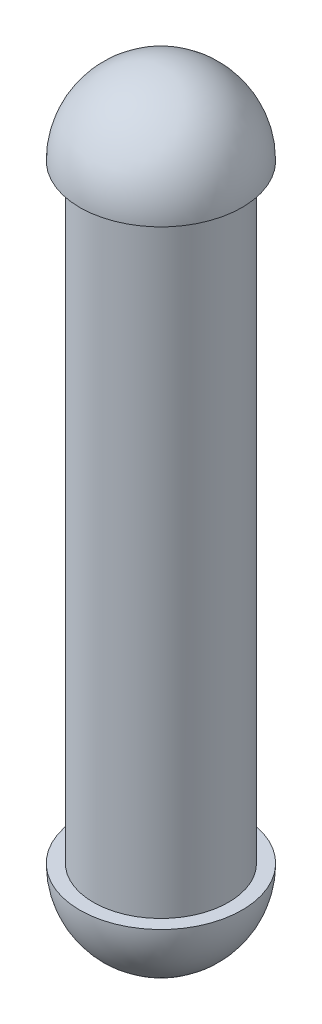
ISO-10303-21;
HEADER;
FILE_DESCRIPTION(('STEP AP214'),'2;1');
FILE_NAME('part.step','',(''),(''),'','','');
FILE_SCHEMA(('AUTOMOTIVE_DESIGN { 1 0 10303 214 1 1 1 1 }'));
ENDSEC;
DATA;
#1=APPLICATION_CONTEXT('core data for automotive mechanical design processes');
#2=APPLICATION_PROTOCOL_DEFINITION('international standard','automotive_design',2000,#1);
#3=PRODUCT_CONTEXT('',#1,'mechanical');
#4=PRODUCT('Part','Part','',(#3));
#5=PRODUCT_RELATED_PRODUCT_CATEGORY('part','',(#4));
#6=PRODUCT_DEFINITION_FORMATION('','',#4);
#7=PRODUCT_DEFINITION_CONTEXT('part definition',#1,'design');
#8=PRODUCT_DEFINITION('design','',#6,#7);
#9=PRODUCT_DEFINITION_SHAPE('','',#8);
#10=(LENGTH_UNIT() NAMED_UNIT(*) SI_UNIT(.MILLI.,.METRE.));
#11=(NAMED_UNIT(*) PLANE_ANGLE_UNIT() SI_UNIT($,.RADIAN.));
#12=(NAMED_UNIT(*) SI_UNIT($,.STERADIAN.) SOLID_ANGLE_UNIT());
#13=UNCERTAINTY_MEASURE_WITH_UNIT(LENGTH_MEASURE(1.E-05),#10,'distance_accuracy_value','');
#14=(GEOMETRIC_REPRESENTATION_CONTEXT(3) GLOBAL_UNCERTAINTY_ASSIGNED_CONTEXT((#13)) GLOBAL_UNIT_ASSIGNED_CONTEXT((#10,
#11,#12)) REPRESENTATION_CONTEXT('',''));
#15=CARTESIAN_POINT('',(0.,0.,0.));
#16=DIRECTION('',(0.,0.,1.));
#17=DIRECTION('',(1.,0.,0.));
#18=AXIS2_PLACEMENT_3D('',#15,#16,#17);
#19=CARTESIAN_POINT('',(0.,4.5,0.));
#20=DIRECTION('',(0.,-1.,0.));
#21=DIRECTION('',(0.,0.,-1.));
#22=AXIS2_PLACEMENT_3D('',#19,#20,#21);
#23=CYLINDRICAL_SURFACE('',#22,1.);
#24=CARTESIAN_POINT('',(0.,4.5,0.));
#25=DIRECTION('',(0.,1.,0.));
#26=DIRECTION('',(0.,0.,1.));
#27=AXIS2_PLACEMENT_3D('',#24,#25,#26);
#28=CIRCLE('',#27,1.);
#29=CARTESIAN_POINT('',(0.,4.5,1.));
#30=VERTEX_POINT('',#29);
#31=EDGE_CURVE('E10',#30,#30,#28,.T.);
#32=ORIENTED_EDGE('',*,*,#31,.F.);
#33=EDGE_LOOP('',(#32));
#34=FACE_BOUND('',#33,.T.);
#35=CARTESIAN_POINT('',(0.,-4.5,0.));
#36=DIRECTION('',(0.,1.,0.));
#37=DIRECTION('',(-1.,0.,0.));
#38=AXIS2_PLACEMENT_3D('',#35,#36,#37);
#39=CIRCLE('',#38,1.);
#40=CARTESIAN_POINT('',(-1.,-4.50000000000001,0.));
#41=VERTEX_POINT('',#40);
#42=EDGE_CURVE('E41',#41,#41,#39,.T.);
#43=ORIENTED_EDGE('',*,*,#42,.T.);
#44=EDGE_LOOP('',(#43));
#45=FACE_BOUND('',#44,.T.);
#46=ADVANCED_FACE('F31',(#34,#45),#23,.T.);
#47=CARTESIAN_POINT('',(0.,4.5,0.));
#48=DIRECTION('',(0.,0.,1.));
#49=DIRECTION('',(-1.,0.,0.));
#50=AXIS2_PLACEMENT_3D('',#47,#48,#49);
#51=SPHERICAL_SURFACE('',#50,1.2);
#52=CARTESIAN_POINT('',(0.,4.5,0.));
#53=DIRECTION('',(0.,-1.,0.));
#54=DIRECTION('',(0.,0.,1.));
#55=AXIS2_PLACEMENT_3D('',#52,#53,#54);
#56=SPHERICAL_SURFACE('',#55,1.2);
#57=CARTESIAN_POINT('',(0.,4.5,0.));
#58=DIRECTION('',(0.,-1.,0.));
#59=DIRECTION('',(0.,0.,1.));
#60=AXIS2_PLACEMENT_3D('',#57,#58,#59);
#61=CIRCLE('',#60,1.2);
#62=CARTESIAN_POINT('',(0.,4.5,1.2));
#63=VERTEX_POINT('',#62);
#64=EDGE_CURVE('E37',#63,#63,#61,.T.);
#65=ORIENTED_EDGE('',*,*,#64,.F.);
#66=EDGE_LOOP('',(#65));
#67=FACE_BOUND('',#66,.T.);
#68=ADVANCED_FACE('F64',(#67),#56,.T.);
#69=CARTESIAN_POINT('',(0.,4.5,0.));
#70=DIRECTION('',(0.,-1.,0.));
#71=DIRECTION('',(0.,0.,1.));
#72=AXIS2_PLACEMENT_3D('',#69,#70,#71);
#73=PLANE('',#72);
#74=ORIENTED_EDGE('',*,*,#31,.T.);
#75=EDGE_LOOP('',(#74));
#76=FACE_BOUND('',#75,.T.);
#77=ORIENTED_EDGE('',*,*,#64,.T.);
#78=EDGE_LOOP('',(#77));
#79=FACE_BOUND('',#78,.T.);
#80=ADVANCED_FACE('F60',(#76,#79),#73,.T.);
#81=CARTESIAN_POINT('',(0.,-4.5,0.));
#82=DIRECTION('',(0.,0.,1.));
#83=DIRECTION('',(-1.,0.,0.));
#84=AXIS2_PLACEMENT_3D('',#81,#82,#83);
#85=SPHERICAL_SURFACE('',#84,1.2);
#86=CARTESIAN_POINT('',(0.,-4.5,0.));
#87=DIRECTION('',(0.,-1.,0.));
#88=DIRECTION('',(0.,0.,1.));
#89=AXIS2_PLACEMENT_3D('',#86,#87,#88);
#90=SPHERICAL_SURFACE('',#89,1.2);
#91=CARTESIAN_POINT('',(0.,-4.5,0.));
#92=DIRECTION('',(0.,-1.,0.));
#93=DIRECTION('',(0.,0.,1.));
#94=AXIS2_PLACEMENT_3D('',#91,#92,#93);
#95=CIRCLE('',#94,1.2);
#96=CARTESIAN_POINT('',(0.,-4.5,1.2));
#97=VERTEX_POINT('',#96);
#98=EDGE_CURVE('E45',#97,#97,#95,.T.);
#99=ORIENTED_EDGE('',*,*,#98,.T.);
#100=EDGE_LOOP('',(#99));
#101=FACE_BOUND('',#100,.T.);
#102=ADVANCED_FACE('F51',(#101),#90,.T.);
#103=CARTESIAN_POINT('',(0.,-4.5,0.));
#104=DIRECTION('',(0.,1.,0.));
#105=DIRECTION('',(0.,0.,1.));
#106=AXIS2_PLACEMENT_3D('',#103,#104,#105);
#107=PLANE('',#106);
#108=ORIENTED_EDGE('',*,*,#42,.F.);
#109=EDGE_LOOP('',(#108));
#110=FACE_BOUND('',#109,.T.);
#111=ORIENTED_EDGE('',*,*,#98,.F.);
#112=EDGE_LOOP('',(#111));
#113=FACE_BOUND('',#112,.T.);
#114=ADVANCED_FACE('F53',(#110,#113),#107,.T.);
#115=CLOSED_SHELL('',(#46,#68,#80,#102,#114));
#116=MANIFOLD_SOLID_BREP('B2',#115);
#117=ADVANCED_BREP_SHAPE_REPRESENTATION('',(#18,#116),#14);
#118=SHAPE_DEFINITION_REPRESENTATION(#9,#117);
ENDSEC;
END-ISO-10303-21;
